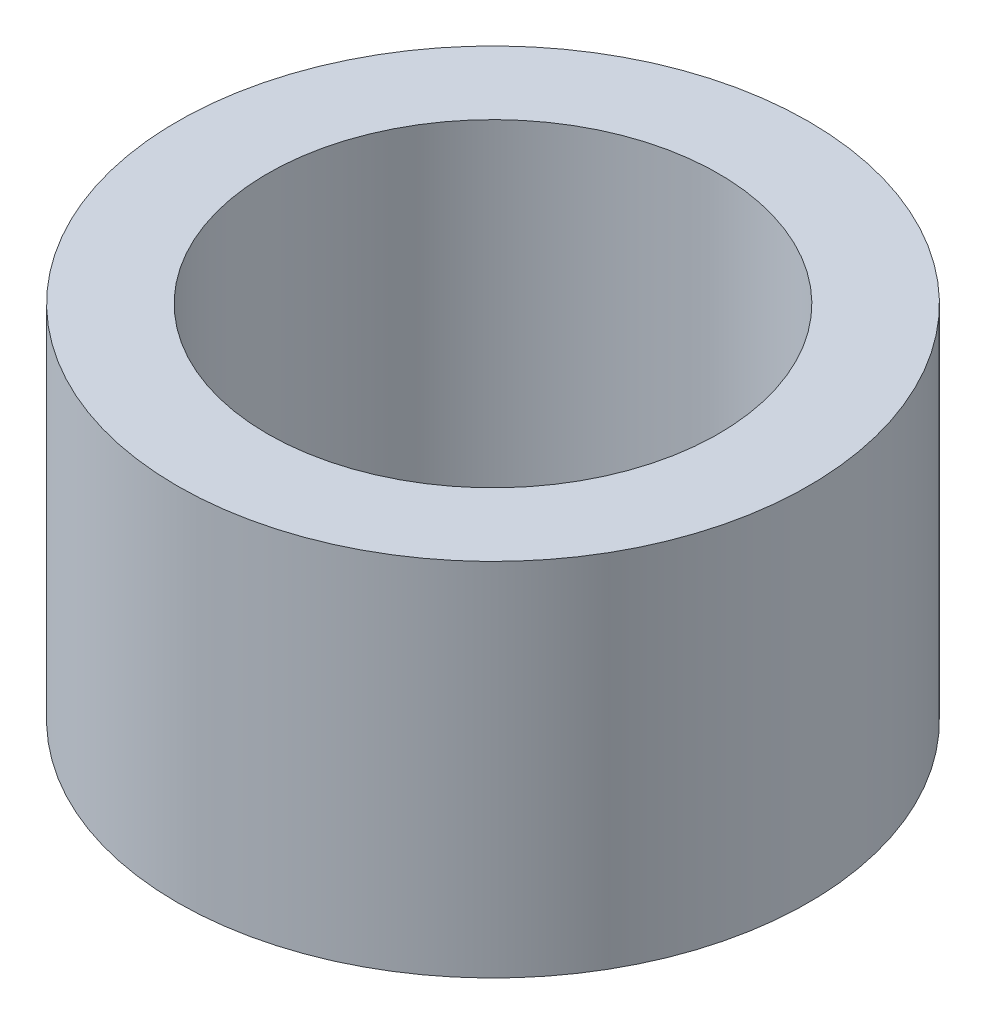
ISO-10303-21;
HEADER;
FILE_DESCRIPTION(('STEP AP214'),'2;1');
FILE_NAME('part.step','',(''),(''),'','','');
FILE_SCHEMA(('AUTOMOTIVE_DESIGN { 1 0 10303 214 1 1 1 1 }'));
ENDSEC;
DATA;
#1=APPLICATION_CONTEXT('core data for automotive mechanical design processes');
#2=APPLICATION_PROTOCOL_DEFINITION('international standard','automotive_design',2000,#1);
#3=PRODUCT_CONTEXT('',#1,'mechanical');
#4=PRODUCT('Part','Part','',(#3));
#5=PRODUCT_RELATED_PRODUCT_CATEGORY('part','',(#4));
#6=PRODUCT_DEFINITION_FORMATION('','',#4);
#7=PRODUCT_DEFINITION_CONTEXT('part definition',#1,'design');
#8=PRODUCT_DEFINITION('design','',#6,#7);
#9=PRODUCT_DEFINITION_SHAPE('','',#8);
#10=(LENGTH_UNIT() NAMED_UNIT(*) SI_UNIT(.MILLI.,.METRE.));
#11=(NAMED_UNIT(*) PLANE_ANGLE_UNIT() SI_UNIT($,.RADIAN.));
#12=(NAMED_UNIT(*) SI_UNIT($,.STERADIAN.) SOLID_ANGLE_UNIT());
#13=UNCERTAINTY_MEASURE_WITH_UNIT(LENGTH_MEASURE(1.E-05),#10,'distance_accuracy_value','');
#14=(GEOMETRIC_REPRESENTATION_CONTEXT(3) GLOBAL_UNCERTAINTY_ASSIGNED_CONTEXT((#13)) GLOBAL_UNIT_ASSIGNED_CONTEXT((#10,
#11,#12)) REPRESENTATION_CONTEXT('',''));
#15=CARTESIAN_POINT('',(0.,0.,0.));
#16=DIRECTION('',(0.,0.,1.));
#17=DIRECTION('',(1.,0.,0.));
#18=AXIS2_PLACEMENT_3D('',#15,#16,#17);
#19=CARTESIAN_POINT('',(0.,8.,0.));
#20=DIRECTION('',(0.,1.,0.));
#21=DIRECTION('',(0.,0.,1.));
#22=AXIS2_PLACEMENT_3D('',#19,#20,#21);
#23=PLANE('',#22);
#24=CARTESIAN_POINT('',(0.,8.,0.));
#25=DIRECTION('',(0.,1.,0.));
#26=DIRECTION('',(0.,0.,1.));
#27=AXIS2_PLACEMENT_3D('',#24,#25,#26);
#28=CIRCLE('',#27,7.);
#29=CARTESIAN_POINT('',(0.,8.,7.));
#30=VERTEX_POINT('',#29);
#31=EDGE_CURVE('E10',#30,#30,#28,.T.);
#32=ORIENTED_EDGE('',*,*,#31,.T.);
#33=EDGE_LOOP('',(#32));
#34=FACE_BOUND('',#33,.T.);
#35=CARTESIAN_POINT('',(0.,8.,0.));
#36=DIRECTION('',(0.,1.,0.));
#37=DIRECTION('',(0.,0.,1.));
#38=AXIS2_PLACEMENT_3D('',#35,#36,#37);
#39=CIRCLE('',#38,5.);
#40=CARTESIAN_POINT('',(0.,8.,5.));
#41=VERTEX_POINT('',#40);
#42=EDGE_CURVE('E43',#41,#41,#39,.T.);
#43=ORIENTED_EDGE('',*,*,#42,.F.);
#44=EDGE_LOOP('',(#43));
#45=FACE_BOUND('',#44,.T.);
#46=ADVANCED_FACE('F32',(#34,#45),#23,.T.);
#47=CARTESIAN_POINT('',(0.,0.,0.));
#48=DIRECTION('',(0.,1.,0.));
#49=DIRECTION('',(0.,0.,1.));
#50=AXIS2_PLACEMENT_3D('',#47,#48,#49);
#51=PLANE('',#50);
#52=CARTESIAN_POINT('',(0.,0.,0.));
#53=DIRECTION('',(0.,1.,0.));
#54=DIRECTION('',(0.,0.,1.));
#55=AXIS2_PLACEMENT_3D('',#52,#53,#54);
#56=CIRCLE('',#55,7.);
#57=CARTESIAN_POINT('',(0.,0.,7.));
#58=VERTEX_POINT('',#57);
#59=EDGE_CURVE('E36',#58,#58,#56,.T.);
#60=ORIENTED_EDGE('',*,*,#59,.F.);
#61=EDGE_LOOP('',(#60));
#62=FACE_BOUND('',#61,.T.);
#63=CARTESIAN_POINT('',(0.,0.,0.));
#64=DIRECTION('',(0.,1.,0.));
#65=DIRECTION('',(0.,0.,1.));
#66=AXIS2_PLACEMENT_3D('',#63,#64,#65);
#67=CIRCLE('',#66,5.);
#68=CARTESIAN_POINT('',(0.,0.,5.));
#69=VERTEX_POINT('',#68);
#70=EDGE_CURVE('E45',#69,#69,#67,.T.);
#71=ORIENTED_EDGE('',*,*,#70,.T.);
#72=EDGE_LOOP('',(#71));
#73=FACE_BOUND('',#72,.T.);
#74=ADVANCED_FACE('F55',(#62,#73),#51,.F.);
#75=CARTESIAN_POINT('',(0.,8.,0.));
#76=DIRECTION('',(0.,-1.,0.));
#77=DIRECTION('',(0.,0.,-1.));
#78=AXIS2_PLACEMENT_3D('',#75,#76,#77);
#79=CYLINDRICAL_SURFACE('',#78,7.);
#80=ORIENTED_EDGE('',*,*,#31,.F.);
#81=EDGE_LOOP('',(#80));
#82=FACE_BOUND('',#81,.T.);
#83=ORIENTED_EDGE('',*,*,#59,.T.);
#84=EDGE_LOOP('',(#83));
#85=FACE_BOUND('',#84,.T.);
#86=ADVANCED_FACE('F34',(#82,#85),#79,.T.);
#87=CARTESIAN_POINT('',(0.,8.,0.));
#88=DIRECTION('',(0.,-1.,0.));
#89=DIRECTION('',(0.,0.,-1.));
#90=AXIS2_PLACEMENT_3D('',#87,#88,#89);
#91=CYLINDRICAL_SURFACE('',#90,5.);
#92=ORIENTED_EDGE('',*,*,#42,.T.);
#93=EDGE_LOOP('',(#92));
#94=FACE_BOUND('',#93,.T.);
#95=ORIENTED_EDGE('',*,*,#70,.F.);
#96=EDGE_LOOP('',(#95));
#97=FACE_BOUND('',#96,.T.);
#98=ADVANCED_FACE('F51',(#94,#97),#91,.F.);
#99=CLOSED_SHELL('',(#46,#74,#86,#98));
#100=MANIFOLD_SOLID_BREP('B2',#99);
#101=ADVANCED_BREP_SHAPE_REPRESENTATION('',(#18,#100),#14);
#102=SHAPE_DEFINITION_REPRESENTATION(#9,#101);
ENDSEC;
END-ISO-10303-21;
